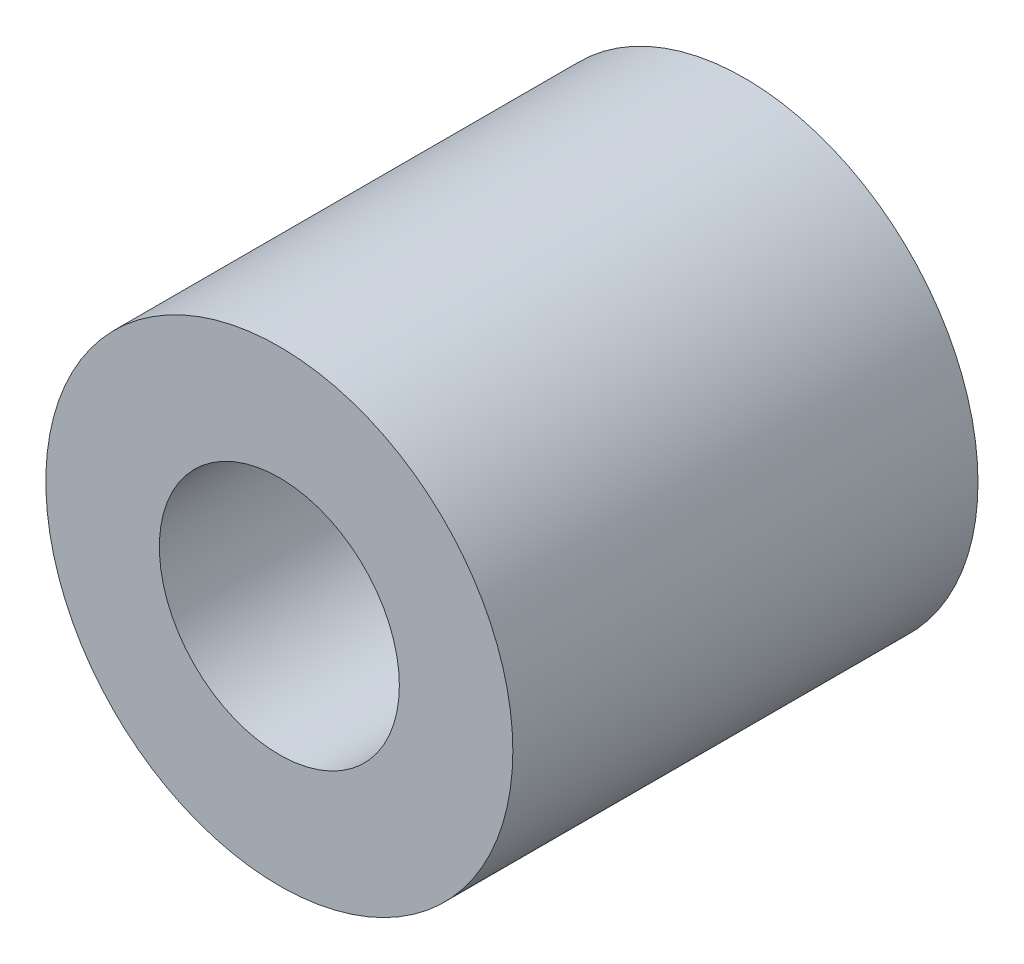
ISO-10303-21;
HEADER;
FILE_DESCRIPTION(('STEP AP214'),'2;1');
FILE_NAME('part.step','',(''),(''),'','','');
FILE_SCHEMA(('AUTOMOTIVE_DESIGN { 1 0 10303 214 1 1 1 1 }'));
ENDSEC;
DATA;
#1=APPLICATION_CONTEXT('core data for automotive mechanical design processes');
#2=APPLICATION_PROTOCOL_DEFINITION('international standard','automotive_design',2000,#1);
#3=PRODUCT_CONTEXT('',#1,'mechanical');
#4=PRODUCT('Part','Part','',(#3));
#5=PRODUCT_RELATED_PRODUCT_CATEGORY('part','',(#4));
#6=PRODUCT_DEFINITION_FORMATION('','',#4);
#7=PRODUCT_DEFINITION_CONTEXT('part definition',#1,'design');
#8=PRODUCT_DEFINITION('design','',#6,#7);
#9=PRODUCT_DEFINITION_SHAPE('','',#8);
#10=(LENGTH_UNIT() NAMED_UNIT(*) SI_UNIT(.MILLI.,.METRE.));
#11=(NAMED_UNIT(*) PLANE_ANGLE_UNIT() SI_UNIT($,.RADIAN.));
#12=(NAMED_UNIT(*) SI_UNIT($,.STERADIAN.) SOLID_ANGLE_UNIT());
#13=UNCERTAINTY_MEASURE_WITH_UNIT(LENGTH_MEASURE(1.E-05),#10,'distance_accuracy_value','');
#14=(GEOMETRIC_REPRESENTATION_CONTEXT(3) GLOBAL_UNCERTAINTY_ASSIGNED_CONTEXT((#13)) GLOBAL_UNIT_ASSIGNED_CONTEXT((#10,
#11,#12)) REPRESENTATION_CONTEXT('',''));
#15=CARTESIAN_POINT('',(0.,0.,0.));
#16=DIRECTION('',(0.,0.,1.));
#17=DIRECTION('',(1.,0.,0.));
#18=AXIS2_PLACEMENT_3D('',#15,#16,#17);
#19=CARTESIAN_POINT('',(0.,0.,3.175));
#20=DIRECTION('',(0.,0.,1.));
#21=DIRECTION('',(1.,0.,0.));
#22=AXIS2_PLACEMENT_3D('',#19,#20,#21);
#23=PLANE('',#22);
#24=CARTESIAN_POINT('',(0.,0.,3.175));
#25=DIRECTION('',(0.,0.,1.));
#26=DIRECTION('',(1.,0.,0.));
#27=AXIS2_PLACEMENT_3D('',#24,#25,#26);
#28=CIRCLE('',#27,3.1877);
#29=CARTESIAN_POINT('',(3.18770000000007,0.,3.175));
#30=VERTEX_POINT('',#29);
#31=EDGE_CURVE('E10',#30,#30,#28,.T.);
#32=ORIENTED_EDGE('',*,*,#31,.T.);
#33=EDGE_LOOP('',(#32));
#34=FACE_BOUND('',#33,.T.);
#35=CARTESIAN_POINT('',(0.,0.,3.175));
#36=DIRECTION('',(0.,0.,1.));
#37=DIRECTION('',(1.,0.,0.));
#38=AXIS2_PLACEMENT_3D('',#35,#36,#37);
#39=CIRCLE('',#38,1.6383);
#40=CARTESIAN_POINT('',(1.63830000000007,0.,3.175));
#41=VERTEX_POINT('',#40);
#42=EDGE_CURVE('E41',#41,#41,#39,.T.);
#43=ORIENTED_EDGE('',*,*,#42,.F.);
#44=EDGE_LOOP('',(#43));
#45=FACE_BOUND('',#44,.T.);
#46=ADVANCED_FACE('F30',(#34,#45),#23,.T.);
#47=CARTESIAN_POINT('',(0.,0.,-3.17499999999997));
#48=DIRECTION('',(0.,0.,1.));
#49=DIRECTION('',(1.,0.,0.));
#50=AXIS2_PLACEMENT_3D('',#47,#48,#49);
#51=PLANE('',#50);
#52=CARTESIAN_POINT('',(0.,0.,-3.17499999999997));
#53=DIRECTION('',(0.,0.,1.));
#54=DIRECTION('',(1.,0.,0.));
#55=AXIS2_PLACEMENT_3D('',#52,#53,#54);
#56=CIRCLE('',#55,3.1877);
#57=CARTESIAN_POINT('',(3.1877,0.,-3.17499999999997));
#58=VERTEX_POINT('',#57);
#59=EDGE_CURVE('E34',#58,#58,#56,.T.);
#60=ORIENTED_EDGE('',*,*,#59,.F.);
#61=EDGE_LOOP('',(#60));
#62=FACE_BOUND('',#61,.T.);
#63=CARTESIAN_POINT('',(0.,0.,-3.17499999999997));
#64=DIRECTION('',(0.,0.,1.));
#65=DIRECTION('',(1.,0.,0.));
#66=AXIS2_PLACEMENT_3D('',#63,#64,#65);
#67=CIRCLE('',#66,1.6383);
#68=CARTESIAN_POINT('',(1.6383,0.,-3.17499999999997));
#69=VERTEX_POINT('',#68);
#70=EDGE_CURVE('E43',#69,#69,#67,.T.);
#71=ORIENTED_EDGE('',*,*,#70,.T.);
#72=EDGE_LOOP('',(#71));
#73=FACE_BOUND('',#72,.T.);
#74=ADVANCED_FACE('F53',(#62,#73),#51,.F.);
#75=CARTESIAN_POINT('',(0.,0.,3.175));
#76=DIRECTION('',(0.,0.,-1.));
#77=DIRECTION('',(-1.,0.,0.));
#78=AXIS2_PLACEMENT_3D('',#75,#76,#77);
#79=CYLINDRICAL_SURFACE('',#78,3.1877);
#80=ORIENTED_EDGE('',*,*,#31,.F.);
#81=EDGE_LOOP('',(#80));
#82=FACE_BOUND('',#81,.T.);
#83=ORIENTED_EDGE('',*,*,#59,.T.);
#84=EDGE_LOOP('',(#83));
#85=FACE_BOUND('',#84,.T.);
#86=ADVANCED_FACE('F32',(#82,#85),#79,.T.);
#87=CARTESIAN_POINT('',(0.,0.,3.175));
#88=DIRECTION('',(0.,0.,-1.));
#89=DIRECTION('',(-1.,0.,0.));
#90=AXIS2_PLACEMENT_3D('',#87,#88,#89);
#91=CYLINDRICAL_SURFACE('',#90,1.6383);
#92=ORIENTED_EDGE('',*,*,#42,.T.);
#93=EDGE_LOOP('',(#92));
#94=FACE_BOUND('',#93,.T.);
#95=ORIENTED_EDGE('',*,*,#70,.F.);
#96=EDGE_LOOP('',(#95));
#97=FACE_BOUND('',#96,.T.);
#98=ADVANCED_FACE('F49',(#94,#97),#91,.F.);
#99=CLOSED_SHELL('',(#46,#74,#86,#98));
#100=MANIFOLD_SOLID_BREP('B2',#99);
#101=ADVANCED_BREP_SHAPE_REPRESENTATION('',(#18,#100),#14);
#102=SHAPE_DEFINITION_REPRESENTATION(#9,#101);
ENDSEC;
END-ISO-10303-21;
